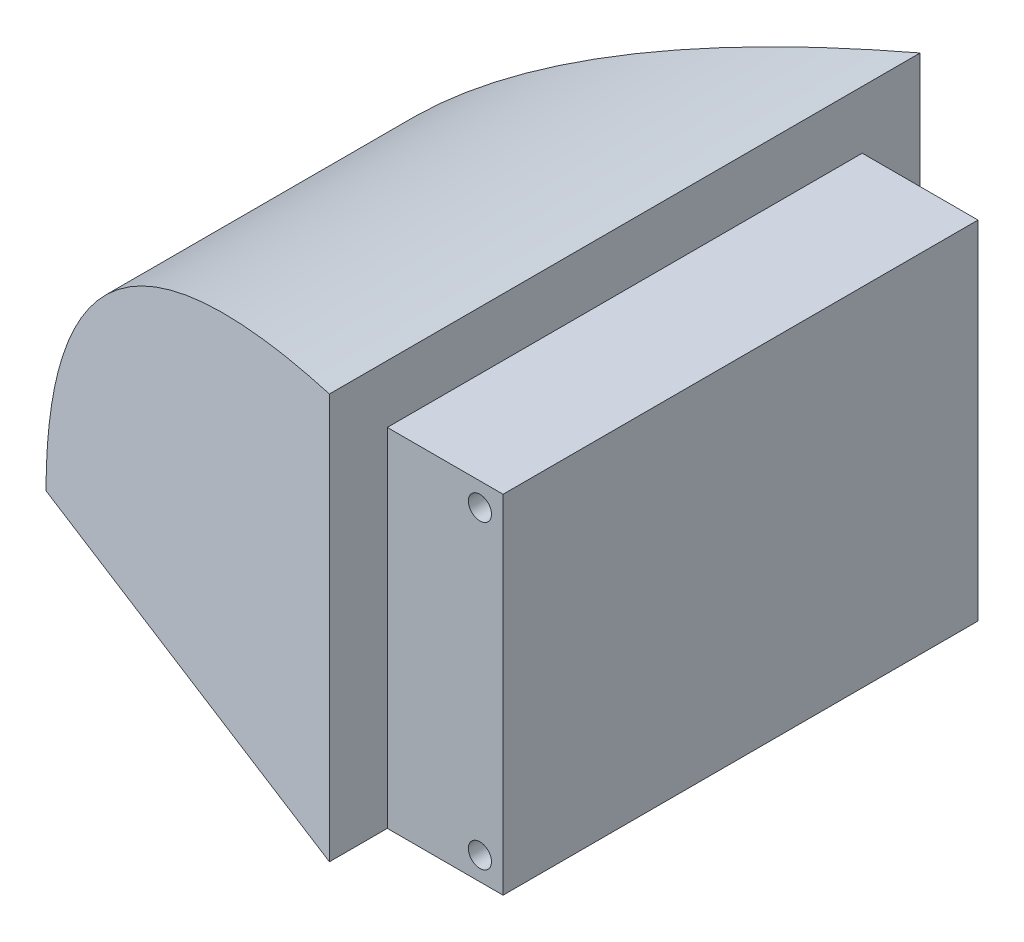
ISO-10303-21;
HEADER;
FILE_DESCRIPTION(('STEP AP214'),'2;1');
FILE_NAME('part.step','',(''),(''),'','','');
FILE_SCHEMA(('AUTOMOTIVE_DESIGN { 1 0 10303 214 1 1 1 1 }'));
ENDSEC;
DATA;
#1=APPLICATION_CONTEXT('core data for automotive mechanical design processes');
#2=APPLICATION_PROTOCOL_DEFINITION('international standard','automotive_design',2000,#1);
#3=PRODUCT_CONTEXT('',#1,'mechanical');
#4=PRODUCT('Part','Part','',(#3));
#5=PRODUCT_RELATED_PRODUCT_CATEGORY('part','',(#4));
#6=PRODUCT_DEFINITION_FORMATION('','',#4);
#7=PRODUCT_DEFINITION_CONTEXT('part definition',#1,'design');
#8=PRODUCT_DEFINITION('design','',#6,#7);
#9=PRODUCT_DEFINITION_SHAPE('','',#8);
#10=(LENGTH_UNIT() NAMED_UNIT(*) SI_UNIT(.MILLI.,.METRE.));
#11=(NAMED_UNIT(*) PLANE_ANGLE_UNIT() SI_UNIT($,.RADIAN.));
#12=(NAMED_UNIT(*) SI_UNIT($,.STERADIAN.) SOLID_ANGLE_UNIT());
#13=UNCERTAINTY_MEASURE_WITH_UNIT(LENGTH_MEASURE(1.E-05),#10,'distance_accuracy_value','');
#14=(GEOMETRIC_REPRESENTATION_CONTEXT(3) GLOBAL_UNCERTAINTY_ASSIGNED_CONTEXT((#13)) GLOBAL_UNIT_ASSIGNED_CONTEXT((#10,
#11,#12)) REPRESENTATION_CONTEXT('',''));
#15=CARTESIAN_POINT('',(0.,0.,0.));
#16=DIRECTION('',(0.,0.,1.));
#17=DIRECTION('',(1.,0.,0.));
#18=AXIS2_PLACEMENT_3D('',#15,#16,#17);
#19=CARTESIAN_POINT('',(-25.,-17.5,51.03));
#20=DIRECTION('',(0.,1.,0.));
#21=DIRECTION('',(0.,0.,1.));
#22=AXIS2_PLACEMENT_3D('',#19,#20,#21);
#23=PLANE('',#22);
#24=DIRECTION('',(-0.932323624442217,0.,-0.361625025830525));
#25=VECTOR('',#24,1.);
#26=CARTESIAN_POINT('',(-15.2432539503768,-17.5,39.2993978739976));
#27=LINE('',#26,#25);
#28=CARTESIAN_POINT('',(15.,-17.5,51.03));
#29=VERTEX_POINT('',#28);
#30=CARTESIAN_POINT('',(-24.9999999704446,-17.4999840573719,35.515));
#31=VERTEX_POINT('',#30);
#32=EDGE_CURVE('E135',#29,#31,#27,.T.);
#33=ORIENTED_EDGE('',*,*,#32,.T.);
#34=DIRECTION('',(0.,0.,-1.));
#35=VECTOR('',#34,1.);
#36=CARTESIAN_POINT('',(-25.,-17.5,51.03));
#37=LINE('',#36,#35);
#38=CARTESIAN_POINT('',(-24.9999999704446,-17.4999840573709,15.515));
#39=VERTEX_POINT('',#38);
#40=EDGE_CURVE('E154',#31,#39,#37,.T.);
#41=ORIENTED_EDGE('',*,*,#40,.T.);
#42=DIRECTION('',(-0.932323624442217,0.,0.361625025830525));
#43=VECTOR('',#42,1.);
#44=CARTESIAN_POINT('',(1.96158988960392,-17.5,5.05727332156988));
#45=LINE('',#44,#43);
#46=CARTESIAN_POINT('',(15.,-17.5,0.));
#47=VERTEX_POINT('',#46);
#48=EDGE_CURVE('E65',#47,#39,#45,.T.);
#49=ORIENTED_EDGE('',*,*,#48,.F.);
#50=DIRECTION('',(0.,0.,-1.));
#51=VECTOR('',#50,1.);
#52=CARTESIAN_POINT('',(15.,-17.5,51.03));
#53=LINE('',#52,#51);
#54=CARTESIAN_POINT('',(15.,-17.5,5.));
#55=VERTEX_POINT('',#54);
#56=EDGE_CURVE('E173',#55,#47,#53,.T.);
#57=ORIENTED_EDGE('',*,*,#56,.F.);
#58=DIRECTION('',(1.,0.,0.));
#59=VECTOR('',#58,1.);
#60=CARTESIAN_POINT('',(-25.,-17.5,4.99999999999998));
#61=LINE('',#60,#59);
#62=CARTESIAN_POINT('',(25.,-17.5,5.));
#63=VERTEX_POINT('',#62);
#64=EDGE_CURVE('E175',#55,#63,#61,.T.);
#65=ORIENTED_EDGE('',*,*,#64,.T.);
#66=DIRECTION('',(0.,0.,-1.));
#67=VECTOR('',#66,1.);
#68=CARTESIAN_POINT('',(25.,-17.5,51.03));
#69=LINE('',#68,#67);
#70=CARTESIAN_POINT('',(25.,-17.5,46.03));
#71=VERTEX_POINT('',#70);
#72=EDGE_CURVE('E159',#71,#63,#69,.T.);
#73=ORIENTED_EDGE('',*,*,#72,.F.);
#74=DIRECTION('',(1.,0.,0.));
#75=VECTOR('',#74,1.);
#76=CARTESIAN_POINT('',(-25.,-17.5,46.03));
#77=LINE('',#76,#75);
#78=CARTESIAN_POINT('',(15.,-17.5,46.03));
#79=VERTEX_POINT('',#78);
#80=EDGE_CURVE('E172',#79,#71,#77,.T.);
#81=ORIENTED_EDGE('',*,*,#80,.F.);
#82=DIRECTION('',(0.,0.,1.));
#83=VECTOR('',#82,1.);
#84=CARTESIAN_POINT('',(15.,-17.5,51.03));
#85=LINE('',#84,#83);
#86=EDGE_CURVE('E134',#79,#29,#85,.T.);
#87=ORIENTED_EDGE('',*,*,#86,.T.);
#88=EDGE_LOOP('',(#33,#41,#49,#57,#65,#73,#81,#87));
#89=FACE_BOUND('',#88,.T.);
#90=ADVANCED_FACE('F44',(#89),#23,.F.);
#91=CARTESIAN_POINT('',(15.,17.5,0.));
#92=CARTESIAN_POINT('',(-25.0988691364399,8.98885403745211,0.));
#93=CARTESIAN_POINT('',(-25.,-17.7627483341837,0.));
#94=B_SPLINE_CURVE_WITH_KNOTS('',2,(#91,#92,#93),.UNSPECIFIED.,.F.,.F.,(3,3),(0.,1.),.UNSPECIFIED.);
#95=DIRECTION('',(0.,0.,1.));
#96=VECTOR('',#95,1.);
#97=SURFACE_OF_LINEAR_EXTRUSION('',#94,#96);
#98=ORIENTED_EDGE('',*,*,#40,.F.);
#99=CARTESIAN_POINT('',(-24.9999999408892,-17.4999681147439,35.515));
#100=CARTESIAN_POINT('',(-24.998567938841,-17.112172585703,35.5155554524844));
#101=CARTESIAN_POINT('',(-24.9907346332893,-16.7243806117285,35.5185938019046));
#102=CARTESIAN_POINT('',(-24.9617265623105,-15.9489840650427,35.5298453118544));
#103=CARTESIAN_POINT('',(-24.9405383868522,-15.5613800730588,35.5380636737921));
#104=CARTESIAN_POINT('',(-24.8842693680968,-14.7871417084284,35.5598890182567));
#105=CARTESIAN_POINT('',(-24.8491820535896,-14.4005078719705,35.5734985108051));
#106=CARTESIAN_POINT('',(-24.7646464699439,-13.6290042013446,35.6062877506293));
#107=CARTESIAN_POINT('',(-24.7151967366608,-13.244134551088,35.6254680658102));
#108=CARTESIAN_POINT('',(-24.601624905182,-12.4774754090352,35.6695197398601));
#109=CARTESIAN_POINT('',(-24.5375248056618,-12.0956821787223,35.6943825659926));
#110=CARTESIAN_POINT('',(-24.3943205791411,-11.3354411502374,35.749927905377));
#111=CARTESIAN_POINT('',(-24.3152202225053,-10.9569925363491,35.7806089561988));
#112=CARTESIAN_POINT('',(-24.1418126119135,-10.2041977305489,35.847869433151));
#113=CARTESIAN_POINT('',(-24.0475084262727,-9.82985072712813,35.8844476691586));
#114=CARTESIAN_POINT('',(-23.8435971284151,-9.08600511142265,35.9635397638168));
#115=CARTESIAN_POINT('',(-23.7339906022122,-8.71650631406505,36.0060533951672));
#116=CARTESIAN_POINT('',(-23.4595129918599,-7.85810951408493,36.112516398282));
#117=CARTESIAN_POINT('',(-23.2885385029013,-7.3714392863445,36.1788331281871));
#118=CARTESIAN_POINT('',(-22.9194910221877,-6.40998786818405,36.321977419769));
#119=CARTESIAN_POINT('',(-22.7214134410647,-5.93520870742128,36.3988067615471));
#120=CARTESIAN_POINT('',(-22.2990088142225,-4.99930738472935,36.5626469561834));
#121=CARTESIAN_POINT('',(-22.0746829563474,-4.53818460597445,36.6496573483067));
#122=CARTESIAN_POINT('',(-21.6012590174584,-3.63160877482702,36.8332866586033));
#123=CARTESIAN_POINT('',(-21.3521933935708,-3.18613620294092,36.9298929874687));
#124=CARTESIAN_POINT('',(-20.8304984963321,-2.3113628195637,37.1322453957352));
#125=CARTESIAN_POINT('',(-20.5578686217257,-1.88206242111633,37.2379917083481));
#126=CARTESIAN_POINT('',(-19.9906942028894,-1.040441134762,37.4579844860543));
#127=CARTESIAN_POINT('',(-19.6961484839164,-0.628121158890323,37.5722314068009));
#128=CARTESIAN_POINT('',(-19.1111060156734,0.146988220534743,37.7991547541707));
#129=CARTESIAN_POINT('',(-18.8221423661173,0.51111180828939,37.9112365297423));
#130=CARTESIAN_POINT('',(-18.2285630561573,1.22438342794786,38.141471104593));
#131=CARTESIAN_POINT('',(-17.9239458335554,1.5735299587644,38.2596245098097));
#132=CARTESIAN_POINT('',(-16.9886376108621,2.59856984144768,38.6224071866869));
#133=CARTESIAN_POINT('',(-16.3364652785199,3.25209599528699,38.8753685300941));
#134=CARTESIAN_POINT('',(-14.9838575276732,4.50276359893512,39.4000112614537));
#135=CARTESIAN_POINT('',(-14.2832862455038,5.09973416111169,39.6717453475252));
#136=CARTESIAN_POINT('',(-12.8444769829324,6.23902434183808,40.2298234902451));
#137=CARTESIAN_POINT('',(-12.1062315921636,6.78133314571293,40.5161704211895));
#138=CARTESIAN_POINT('',(-10.702453211767,7.74499583163856,41.0606609604859));
#139=CARTESIAN_POINT('',(-10.040714954747,8.17276300106796,41.3173326869275));
#140=CARTESIAN_POINT('',(-8.6985510168258,8.99374321016668,41.8379245243487));
#141=CARTESIAN_POINT('',(-8.01811771463152,9.38694187472886,42.1018475914373));
#142=CARTESIAN_POINT('',(-6.64173772269818,10.1416204234042,42.6357109808084));
#143=CARTESIAN_POINT('',(-5.9457829850476,10.5030833492887,42.9056544246747));
#144=CARTESIAN_POINT('',(-4.54132973827641,11.1967632674944,43.450406727766));
#145=CARTESIAN_POINT('',(-3.8328307635277,11.5289791714536,43.7252157675967));
#146=CARTESIAN_POINT('',(-2.40375108912923,12.1673995573597,44.279520046304));
#147=CARTESIAN_POINT('',(-1.68314540710071,12.4735394844956,44.5590249752208));
#148=CARTESIAN_POINT('',(-0.233591153665069,13.0610629821727,45.1212708312722));
#149=CARTESIAN_POINT('',(0.495353745715018,13.342457008309,45.4040103341192));
#150=CARTESIAN_POINT('',(1.96034635402283,13.8826467812744,45.9722443420666));
#151=CARTESIAN_POINT('',(2.69639303051498,14.1414457595317,46.257738446711));
#152=CARTESIAN_POINT('',(4.17444913260726,14.6383103618176,46.83103945731));
#153=CARTESIAN_POINT('',(4.91645793824825,14.8763781118282,47.118846122798));
#154=CARTESIAN_POINT('',(6.17587208219542,15.2629563543775,47.6073413838815));
#155=CARTESIAN_POINT('',(6.69195865173841,15.416440204082,47.807518462043));
#156=CARTESIAN_POINT('',(7.7262532805094,15.7147780851063,48.2086954911776));
#157=CARTESIAN_POINT('',(8.24446117316913,15.859632780613,48.409695377543));
#158=CARTESIAN_POINT('',(9.28278930018341,16.1411838769457,48.8124368998086));
#159=CARTESIAN_POINT('',(9.80290950884242,16.2778803869698,49.0141785257423));
#160=CARTESIAN_POINT('',(10.8411855160164,16.5426067795997,49.4168998320249));
#161=CARTESIAN_POINT('',(11.3593292827887,16.6706910048478,49.6178748455617));
#162=CARTESIAN_POINT('',(12.3971267315815,16.9196291818275,50.0204105310122));
#163=CARTESIAN_POINT('',(12.916780426472,17.0404830717397,50.2219712079178));
#164=CARTESIAN_POINT('',(13.9574238515272,17.2753113688313,50.6256107764111));
#165=CARTESIAN_POINT('',(14.4784135466668,17.3892859544768,50.8276896544134));
#166=CARTESIAN_POINT('',(15.,17.5,51.03));
#167=B_SPLINE_CURVE_WITH_KNOTS('',3,(#99,#100,#101,#102,#103,#104,#105,#106,#107,#108,#109,#110,
#111,#112,#113,#114,#115,#116,#117,#118,#119,#120,#121,#122,#123,#124,#125,#126,#127,#128,#129,
#130,#131,#132,#133,#134,#135,#136,#137,#138,#139,#140,#141,#142,#143,#144,#145,#146,#147,#148,
#149,#150,#151,#152,#153,#154,#155,#156,#157,#158,#159,#160,#161,#162,#163,#164,#165,#166),
.UNSPECIFIED.,.F.,.F.,(4,2,2,2,2,2,2,2,2,2,2,2,2,2,2,2,2,2,2,2,2,2,2,2,2,2,2,2,2,2,2,2,2,4),(0.,
1.16337012895003,2.32791029833484,3.49299329688164,4.65819510890861,5.82165864198532,
6.98483012131061,8.14776715183187,9.31065965907347,10.8698985843159,12.4294018630663,
13.9888345950627,15.546247806475,17.1037007679113,18.6612372728741,20.0951905098375,
21.5292871316865,24.3973548760403,27.2738293926653,30.1508718991792,32.6359853761638,
35.1221274324096,37.609589992885,40.0971450795766,42.5906895651011,45.0831753691335,
47.5753041246617,50.0671770113215,51.7904108664501,53.5135119122418,55.2365898889596,
56.9475106849216,58.6584461071939,60.3693371245315),.UNSPECIFIED.);
#168=CARTESIAN_POINT('',(15.,17.5,51.03));
#169=VERTEX_POINT('',#168);
#170=EDGE_CURVE('E12',#31,#169,#167,.T.);
#171=ORIENTED_EDGE('',*,*,#170,.T.);
#172=DIRECTION('',(0.,0.,-1.));
#173=VECTOR('',#172,1.);
#174=CARTESIAN_POINT('',(15.,17.5,0.));
#175=LINE('',#174,#173);
#176=CARTESIAN_POINT('',(15.,17.5,0.));
#177=VERTEX_POINT('',#176);
#178=EDGE_CURVE('E73',#169,#177,#175,.T.);
#179=ORIENTED_EDGE('',*,*,#178,.T.);
#180=CARTESIAN_POINT('',(-24.9999999408892,-17.4999681147417,15.515));
#181=CARTESIAN_POINT('',(-24.9985679388409,-17.1121725857009,15.5144445475156));
#182=CARTESIAN_POINT('',(-24.9907346332892,-16.7243806117264,15.5114061980954));
#183=CARTESIAN_POINT('',(-24.9617265623104,-15.9489840650406,15.5001546881456));
#184=CARTESIAN_POINT('',(-24.9405383868521,-15.5613800730567,15.4919363262078));
#185=CARTESIAN_POINT('',(-24.8842693680966,-14.7871417084263,15.4701109817432));
#186=CARTESIAN_POINT('',(-24.8491820535894,-14.4005078719684,15.4565014891948));
#187=CARTESIAN_POINT('',(-24.7646464699436,-13.6290042013425,15.4237122493705));
#188=CARTESIAN_POINT('',(-24.7151967366605,-13.2441345510859,15.4045319341897));
#189=CARTESIAN_POINT('',(-24.6016249051816,-12.4774754090332,15.3604802601398));
#190=CARTESIAN_POINT('',(-24.5375248056614,-12.0956821787203,15.3356174340073));
#191=CARTESIAN_POINT('',(-24.3943205791407,-11.3354411502353,15.2800720946228));
#192=CARTESIAN_POINT('',(-24.3152202225048,-10.956992536347,15.249391043801));
#193=CARTESIAN_POINT('',(-24.141812611913,-10.2041977305469,15.1821305668488));
#194=CARTESIAN_POINT('',(-24.0475084262722,-9.82985072712613,15.1455523308412));
#195=CARTESIAN_POINT('',(-23.8435971284146,-9.08600511142068,15.066460236183));
#196=CARTESIAN_POINT('',(-23.7339906022116,-8.71650631406309,15.0239466048326));
#197=CARTESIAN_POINT('',(-23.4595129918592,-7.85810951408301,14.9174836017177));
#198=CARTESIAN_POINT('',(-23.2885385029006,-7.3714392863426,14.8511668718127));
#199=CARTESIAN_POINT('',(-22.919491022187,-6.40998786818219,14.7080225802307));
#200=CARTESIAN_POINT('',(-22.7214134410639,-5.93520870741944,14.6311932384526));
#201=CARTESIAN_POINT('',(-22.2990088142217,-4.99930738472756,14.4673530438163));
#202=CARTESIAN_POINT('',(-22.0746829563466,-4.53818460597269,14.3803426516929));
#203=CARTESIAN_POINT('',(-21.6012590174574,-3.63160877482531,14.1967133413963));
#204=CARTESIAN_POINT('',(-21.3521933935698,-3.18613620293924,14.1001070125309));
#205=CARTESIAN_POINT('',(-20.8304984963311,-2.31136281956207,13.8977546042644));
#206=CARTESIAN_POINT('',(-20.5578686217247,-1.88206242111473,13.7920082916515));
#207=CARTESIAN_POINT('',(-19.9906942028883,-1.04044113476046,13.5720155139453));
#208=CARTESIAN_POINT('',(-19.6961484839153,-0.628121158888808,13.4577685931987));
#209=CARTESIAN_POINT('',(-19.1111060156722,0.146988220536241,13.2308452458289));
#210=CARTESIAN_POINT('',(-18.8221423661161,0.511111808290893,13.1187634702573));
#211=CARTESIAN_POINT('',(-18.228563056156,1.22438342794937,12.8885288954065));
#212=CARTESIAN_POINT('',(-17.9239458335541,1.57352995876592,12.7703754901898));
#213=CARTESIAN_POINT('',(-16.9886376108606,2.59856984144921,12.4075928133126));
#214=CARTESIAN_POINT('',(-16.3364652785183,3.25209599528853,12.1546314699053));
#215=CARTESIAN_POINT('',(-14.9838575276715,4.50276359893666,11.6299887385456));
#216=CARTESIAN_POINT('',(-14.283286245502,5.09973416111322,11.3582546524741));
#217=CARTESIAN_POINT('',(-12.8444769829303,6.23902434183959,10.8001765097541));
#218=CARTESIAN_POINT('',(-12.1062315921615,6.78133314571445,10.5138295788097));
#219=CARTESIAN_POINT('',(-10.7024532117647,7.74499583164008,9.96933903951322));
#220=CARTESIAN_POINT('',(-10.0407149547446,8.1727630010695,9.71266731307155));
#221=CARTESIAN_POINT('',(-8.69855101682314,8.99374321016826,9.19207547565028));
#222=CARTESIAN_POINT('',(-8.01811771462875,9.38694187473044,8.92815240856163));
#223=CARTESIAN_POINT('',(-6.64173772269516,10.1416204234058,8.39428901919039));
#224=CARTESIAN_POINT('',(-5.94578298504446,10.5030833492903,8.12434557532412));
#225=CARTESIAN_POINT('',(-4.54132973827303,11.196763267496,7.57959327223265));
#226=CARTESIAN_POINT('',(-3.83283076352421,11.5289791714552,7.30478423240195));
#227=CARTESIAN_POINT('',(-2.4037510891255,12.1673995573613,6.75047995369455));
#228=CARTESIAN_POINT('',(-1.68314540709686,12.4735394844972,6.4709750247777));
#229=CARTESIAN_POINT('',(-0.233591153660987,13.0610629821743,5.90872916872626));
#230=CARTESIAN_POINT('',(0.495353745719216,13.3424570083106,5.62598966587916));
#231=CARTESIAN_POINT('',(1.96034635402726,13.882646781276,5.05775565793168));
#232=CARTESIAN_POINT('',(2.69639303051953,14.1414457595333,4.77226155328724));
#233=CARTESIAN_POINT('',(4.17444913261204,14.6383103618192,4.19896054268811));
#234=CARTESIAN_POINT('',(4.91645793825314,14.8763781118298,3.91115387720007));
#235=CARTESIAN_POINT('',(6.17587208220016,15.262956354379,3.42265861611662));
#236=CARTESIAN_POINT('',(6.69195865174287,15.4164402040833,3.22248153795524));
#237=CARTESIAN_POINT('',(7.7262532805133,15.7147780851074,2.8213045088209));
#238=CARTESIAN_POINT('',(8.24446117317276,15.859632780614,2.62030462245562));
#239=CARTESIAN_POINT('',(9.28278930018648,16.1411838769465,2.21756310019017));
#240=CARTESIAN_POINT('',(9.80290950884522,16.2778803869706,2.01582147425666));
#241=CARTESIAN_POINT('',(10.8411855160187,16.5426067796002,1.61310016797426));
#242=CARTESIAN_POINT('',(11.3593292827907,16.6706910048483,1.41212515443757));
#243=CARTESIAN_POINT('',(12.3971267315829,16.9196291818279,1.0095894689873));
#244=CARTESIAN_POINT('',(12.9167804264731,17.0404830717399,0.808028792081731));
#245=CARTESIAN_POINT('',(13.9574238515277,17.2753113688314,0.404389223588679));
#246=CARTESIAN_POINT('',(14.4784135466671,17.3892859544768,0.202310345586502));
#247=CARTESIAN_POINT('',(15.,17.5,0.));
#248=B_SPLINE_CURVE_WITH_KNOTS('',3,(#180,#181,#182,#183,#184,#185,#186,#187,#188,#189,#190,
#191,#192,#193,#194,#195,#196,#197,#198,#199,#200,#201,#202,#203,#204,#205,#206,#207,#208,#209,
#210,#211,#212,#213,#214,#215,#216,#217,#218,#219,#220,#221,#222,#223,#224,#225,#226,#227,#228,
#229,#230,#231,#232,#233,#234,#235,#236,#237,#238,#239,#240,#241,#242,#243,#244,#245,#246,#247),
.UNSPECIFIED.,.F.,.F.,(4,2,2,2,2,2,2,2,2,2,2,2,2,2,2,2,2,2,2,2,2,2,2,2,2,2,2,2,2,2,2,2,2,4),(0.,
1.16337012895002,2.32791029833482,3.4929932968816,4.65819510890856,5.82165864198526,
6.98483012131053,8.14776715183177,9.31065965907335,10.8698985843158,12.4294018630661,
13.9888345950625,15.5462478064748,17.1037007679111,18.6612372728738,20.0951905098374,
21.5292871316864,24.3973548760404,27.2738293926657,30.1508718991798,32.6359853761648,
35.122127432411,37.6095899928867,40.0971450795786,42.5906895651035,45.0831753691362,
47.5753041246647,50.0671770113249,51.7904108664526,53.5135119122433,55.2365898889602,
56.9475106849212,58.6584461071927,60.3693371245293),.UNSPECIFIED.);
#249=EDGE_CURVE('E58',#39,#177,#248,.T.);
#250=ORIENTED_EDGE('',*,*,#249,.F.);
#251=EDGE_LOOP('',(#98,#171,#179,#250));
#252=FACE_BOUND('',#251,.T.);
#253=ADVANCED_FACE('F167',(#252),#97,.T.);
#254=CARTESIAN_POINT('',(25.,17.5,51.03));
#255=DIRECTION('',(-1.,0.,0.));
#256=DIRECTION('',(0.,0.,1.));
#257=AXIS2_PLACEMENT_3D('',#254,#255,#256);
#258=PLANE('',#257);
#259=DIRECTION('',(0.,1.,0.));
#260=VECTOR('',#259,1.);
#261=CARTESIAN_POINT('',(25.,-33.53,5.));
#262=LINE('',#261,#260);
#263=CARTESIAN_POINT('',(25.,12.5,5.));
#264=VERTEX_POINT('',#263);
#265=EDGE_CURVE('E148',#63,#264,#262,.T.);
#266=ORIENTED_EDGE('',*,*,#265,.T.);
#267=DIRECTION('',(0.,0.,-1.));
#268=VECTOR('',#267,1.);
#269=CARTESIAN_POINT('',(25.,12.5,46.03));
#270=LINE('',#269,#268);
#271=CARTESIAN_POINT('',(25.,12.5,46.03));
#272=VERTEX_POINT('',#271);
#273=EDGE_CURVE('E120',#272,#264,#270,.T.);
#274=ORIENTED_EDGE('',*,*,#273,.F.);
#275=DIRECTION('',(0.,1.,0.));
#276=VECTOR('',#275,1.);
#277=CARTESIAN_POINT('',(25.,-33.53,46.03));
#278=LINE('',#277,#276);
#279=EDGE_CURVE('E129',#71,#272,#278,.T.);
#280=ORIENTED_EDGE('',*,*,#279,.F.);
#281=ORIENTED_EDGE('',*,*,#72,.T.);
#282=EDGE_LOOP('',(#266,#274,#280,#281));
#283=FACE_BOUND('',#282,.T.);
#284=ADVANCED_FACE('F183',(#283),#258,.F.);
#285=CARTESIAN_POINT('',(0.,-33.53,4.99999999999999));
#286=DIRECTION('',(0.,0.,1.));
#287=DIRECTION('',(1.,0.,0.));
#288=AXIS2_PLACEMENT_3D('',#285,#286,#287);
#289=PLANE('',#288);
#290=CARTESIAN_POINT('',(23.,10.5,5.));
#291=DIRECTION('',(0.,0.,1.));
#292=DIRECTION('',(1.,0.,0.));
#293=AXIS2_PLACEMENT_3D('',#290,#291,#292);
#294=CIRCLE('',#293,1.);
#295=CARTESIAN_POINT('',(24.,10.5,5.));
#296=VERTEX_POINT('',#295);
#297=EDGE_CURVE('E184',#296,#296,#294,.T.);
#298=ORIENTED_EDGE('',*,*,#297,.T.);
#299=EDGE_LOOP('',(#298));
#300=FACE_BOUND('',#299,.T.);
#301=CARTESIAN_POINT('',(23.,-15.5,5.));
#302=DIRECTION('',(0.,0.,1.));
#303=DIRECTION('',(1.,0.,0.));
#304=AXIS2_PLACEMENT_3D('',#301,#302,#303);
#305=CIRCLE('',#304,1.);
#306=CARTESIAN_POINT('',(24.,-15.5,5.));
#307=VERTEX_POINT('',#306);
#308=EDGE_CURVE('E187',#307,#307,#305,.T.);
#309=ORIENTED_EDGE('',*,*,#308,.T.);
#310=EDGE_LOOP('',(#309));
#311=FACE_BOUND('',#310,.T.);
#312=DIRECTION('',(0.,1.,0.));
#313=VECTOR('',#312,1.);
#314=CARTESIAN_POINT('',(15.,-33.53,5.));
#315=LINE('',#314,#313);
#316=CARTESIAN_POINT('',(15.,12.5,5.));
#317=VERTEX_POINT('',#316);
#318=EDGE_CURVE('E146',#55,#317,#315,.T.);
#319=ORIENTED_EDGE('',*,*,#318,.T.);
#320=DIRECTION('',(1.,0.,0.));
#321=VECTOR('',#320,1.);
#322=CARTESIAN_POINT('',(15.,12.5,5.));
#323=LINE('',#322,#321);
#324=EDGE_CURVE('E116',#317,#264,#323,.T.);
#325=ORIENTED_EDGE('',*,*,#324,.T.);
#326=ORIENTED_EDGE('',*,*,#265,.F.);
#327=ORIENTED_EDGE('',*,*,#64,.F.);
#328=EDGE_LOOP('',(#319,#325,#326,#327));
#329=FACE_BOUND('',#328,.T.);
#330=ADVANCED_FACE('F208',(#300,#311,#329),#289,.F.);
#331=CARTESIAN_POINT('',(15.,-33.53,0.));
#332=DIRECTION('',(1.,0.,0.));
#333=DIRECTION('',(0.,0.,-1.));
#334=AXIS2_PLACEMENT_3D('',#331,#332,#333);
#335=PLANE('',#334);
#336=ORIENTED_EDGE('',*,*,#56,.T.);
#337=DIRECTION('',(0.,1.,0.));
#338=VECTOR('',#337,1.);
#339=CARTESIAN_POINT('',(15.,0.,0.));
#340=LINE('',#339,#338);
#341=EDGE_CURVE('E158',#47,#177,#340,.T.);
#342=ORIENTED_EDGE('',*,*,#341,.T.);
#343=ORIENTED_EDGE('',*,*,#178,.F.);
#344=DIRECTION('',(0.,-1.,0.));
#345=VECTOR('',#344,1.);
#346=CARTESIAN_POINT('',(15.,0.,51.03));
#347=LINE('',#346,#345);
#348=EDGE_CURVE('E142',#169,#29,#347,.T.);
#349=ORIENTED_EDGE('',*,*,#348,.T.);
#350=ORIENTED_EDGE('',*,*,#86,.F.);
#351=DIRECTION('',(0.,1.,0.));
#352=VECTOR('',#351,1.);
#353=CARTESIAN_POINT('',(15.,-33.53,46.03));
#354=LINE('',#353,#352);
#355=CARTESIAN_POINT('',(15.,12.5,46.03));
#356=VERTEX_POINT('',#355);
#357=EDGE_CURVE('E126',#79,#356,#354,.T.);
#358=ORIENTED_EDGE('',*,*,#357,.T.);
#359=DIRECTION('',(0.,0.,-1.));
#360=VECTOR('',#359,1.);
#361=CARTESIAN_POINT('',(15.,12.5,46.03));
#362=LINE('',#361,#360);
#363=EDGE_CURVE('E110',#356,#317,#362,.T.);
#364=ORIENTED_EDGE('',*,*,#363,.T.);
#365=ORIENTED_EDGE('',*,*,#318,.F.);
#366=EDGE_LOOP('',(#336,#342,#343,#349,#350,#358,#364,#365));
#367=FACE_BOUND('',#366,.T.);
#368=ADVANCED_FACE('F132',(#367),#335,.T.);
#369=CARTESIAN_POINT('',(0.,-33.53,46.03));
#370=DIRECTION('',(0.,0.,1.));
#371=DIRECTION('',(1.,0.,0.));
#372=AXIS2_PLACEMENT_3D('',#369,#370,#371);
#373=PLANE('',#372);
#374=CARTESIAN_POINT('',(23.,10.5,46.03));
#375=DIRECTION('',(0.,0.,1.));
#376=DIRECTION('',(1.,0.,0.));
#377=AXIS2_PLACEMENT_3D('',#374,#375,#376);
#378=CIRCLE('',#377,1.);
#379=CARTESIAN_POINT('',(24.,10.5,46.03));
#380=VERTEX_POINT('',#379);
#381=EDGE_CURVE('E354',#380,#380,#378,.T.);
#382=ORIENTED_EDGE('',*,*,#381,.F.);
#383=EDGE_LOOP('',(#382));
#384=FACE_BOUND('',#383,.T.);
#385=CARTESIAN_POINT('',(23.,-15.5,46.03));
#386=DIRECTION('',(0.,0.,1.));
#387=DIRECTION('',(1.,0.,0.));
#388=AXIS2_PLACEMENT_3D('',#385,#386,#387);
#389=CIRCLE('',#388,1.);
#390=CARTESIAN_POINT('',(24.,-15.5,46.03));
#391=VERTEX_POINT('',#390);
#392=EDGE_CURVE('E362',#391,#391,#389,.T.);
#393=ORIENTED_EDGE('',*,*,#392,.F.);
#394=EDGE_LOOP('',(#393));
#395=FACE_BOUND('',#394,.T.);
#396=DIRECTION('',(1.,0.,0.));
#397=VECTOR('',#396,1.);
#398=CARTESIAN_POINT('',(15.,12.5,46.03));
#399=LINE('',#398,#397);
#400=EDGE_CURVE('E113',#356,#272,#399,.T.);
#401=ORIENTED_EDGE('',*,*,#400,.F.);
#402=ORIENTED_EDGE('',*,*,#357,.F.);
#403=ORIENTED_EDGE('',*,*,#80,.T.);
#404=ORIENTED_EDGE('',*,*,#279,.T.);
#405=EDGE_LOOP('',(#401,#402,#403,#404));
#406=FACE_BOUND('',#405,.T.);
#407=ADVANCED_FACE('F125',(#384,#395,#406),#373,.T.);
#408=CARTESIAN_POINT('',(1.96158988960392,17.5005,5.05727332156988));
#409=DIRECTION('',(0.361625025830525,0.,0.932323624442217));
#410=DIRECTION('',(0.932323624442217,0.,-0.361625025830525));
#411=AXIS2_PLACEMENT_3D('',#408,#409,#410);
#412=PLANE('',#411);
#413=ORIENTED_EDGE('',*,*,#249,.T.);
#414=ORIENTED_EDGE('',*,*,#341,.F.);
#415=ORIENTED_EDGE('',*,*,#48,.T.);
#416=EDGE_LOOP('',(#413,#414,#415));
#417=FACE_BOUND('',#416,.T.);
#418=ADVANCED_FACE('F164',(#417),#412,.F.);
#419=CARTESIAN_POINT('',(-15.2432539503768,17.5005,39.2993978739976));
#420=DIRECTION('',(-0.361625025830525,0.,0.932323624442217));
#421=DIRECTION('',(0.932323624442217,0.,0.361625025830525));
#422=AXIS2_PLACEMENT_3D('',#419,#420,#421);
#423=PLANE('',#422);
#424=ORIENTED_EDGE('',*,*,#32,.F.);
#425=ORIENTED_EDGE('',*,*,#348,.F.);
#426=ORIENTED_EDGE('',*,*,#170,.F.);
#427=EDGE_LOOP('',(#424,#425,#426));
#428=FACE_BOUND('',#427,.T.);
#429=ADVANCED_FACE('F169',(#428),#423,.T.);
#430=CARTESIAN_POINT('',(15.,12.5,46.03));
#431=DIRECTION('',(0.,-1.,0.));
#432=DIRECTION('',(0.,0.,-1.));
#433=AXIS2_PLACEMENT_3D('',#430,#431,#432);
#434=PLANE('',#433);
#435=ORIENTED_EDGE('',*,*,#273,.T.);
#436=ORIENTED_EDGE('',*,*,#324,.F.);
#437=ORIENTED_EDGE('',*,*,#363,.F.);
#438=ORIENTED_EDGE('',*,*,#400,.T.);
#439=EDGE_LOOP('',(#435,#436,#437,#438));
#440=FACE_BOUND('',#439,.T.);
#441=ADVANCED_FACE('F112',(#440),#434,.F.);
#442=CARTESIAN_POINT('',(23.,-15.5,-3.2622911144252));
#443=DIRECTION('',(0.,0.,1.));
#444=DIRECTION('',(1.,0.,0.));
#445=AXIS2_PLACEMENT_3D('',#442,#443,#444);
#446=CYLINDRICAL_SURFACE('',#445,1.);
#447=CARTESIAN_POINT('',(24.,-15.5,46.03));
#448=CARTESIAN_POINT('',(24.,-15.5,45.6026041666667));
#449=CARTESIAN_POINT('',(24.,-15.5,45.1752083333334));
#450=CARTESIAN_POINT('',(24.,-15.5,44.3204166666667));
#451=CARTESIAN_POINT('',(24.,-15.5,43.8930208333333));
#452=CARTESIAN_POINT('',(24.,-15.5,43.0382291666667));
#453=CARTESIAN_POINT('',(24.,-15.5,42.6108333333333));
#454=CARTESIAN_POINT('',(24.,-15.5,41.7560416666667));
#455=CARTESIAN_POINT('',(24.,-15.5,41.3286458333333));
#456=CARTESIAN_POINT('',(24.,-15.5,40.4738541666667));
#457=CARTESIAN_POINT('',(24.,-15.5,40.0464583333333));
#458=CARTESIAN_POINT('',(24.,-15.5,39.1916666666667));
#459=CARTESIAN_POINT('',(24.,-15.5,38.7642708333333));
#460=CARTESIAN_POINT('',(24.,-15.5,37.9094791666667));
#461=CARTESIAN_POINT('',(24.,-15.5,37.4820833333333));
#462=CARTESIAN_POINT('',(24.,-15.5,36.6272916666667));
#463=CARTESIAN_POINT('',(24.,-15.5,36.1998958333333));
#464=CARTESIAN_POINT('',(24.,-15.5,35.3451041666667));
#465=CARTESIAN_POINT('',(24.,-15.5,34.9177083333333));
#466=CARTESIAN_POINT('',(24.,-15.5,34.0629166666667));
#467=CARTESIAN_POINT('',(24.,-15.5,33.6355208333333));
#468=CARTESIAN_POINT('',(24.,-15.5,32.7807291666667));
#469=CARTESIAN_POINT('',(24.,-15.5,32.3533333333333));
#470=CARTESIAN_POINT('',(24.,-15.5,31.4985416666667));
#471=CARTESIAN_POINT('',(24.,-15.5,31.0711458333333));
#472=CARTESIAN_POINT('',(24.,-15.5,30.2163541666667));
#473=CARTESIAN_POINT('',(24.,-15.5,29.7889583333333));
#474=CARTESIAN_POINT('',(24.,-15.5,28.9341666666667));
#475=CARTESIAN_POINT('',(24.,-15.5,28.5067708333333));
#476=CARTESIAN_POINT('',(24.,-15.5,27.6519791666667));
#477=CARTESIAN_POINT('',(24.,-15.5,27.2245833333333));
#478=CARTESIAN_POINT('',(24.,-15.5,26.3697916666667));
#479=CARTESIAN_POINT('',(24.,-15.5,25.9423958333333));
#480=CARTESIAN_POINT('',(24.,-15.5,25.0876041666667));
#481=CARTESIAN_POINT('',(24.,-15.5,24.6602083333333));
#482=CARTESIAN_POINT('',(24.,-15.5,23.8054166666667));
#483=CARTESIAN_POINT('',(24.,-15.5,23.3780208333333));
#484=CARTESIAN_POINT('',(24.,-15.5,22.5232291666667));
#485=CARTESIAN_POINT('',(24.,-15.5,22.0958333333333));
#486=CARTESIAN_POINT('',(24.,-15.5,21.2410416666667));
#487=CARTESIAN_POINT('',(24.,-15.5,20.8136458333333));
#488=CARTESIAN_POINT('',(24.,-15.5,19.9588541666667));
#489=CARTESIAN_POINT('',(24.,-15.5,19.5314583333333));
#490=CARTESIAN_POINT('',(24.,-15.5,18.6766666666667));
#491=CARTESIAN_POINT('',(24.,-15.5,18.2492708333333));
#492=CARTESIAN_POINT('',(24.,-15.5,17.3944791666667));
#493=CARTESIAN_POINT('',(24.,-15.5,16.9670833333333));
#494=CARTESIAN_POINT('',(24.,-15.5,16.1122916666667));
#495=CARTESIAN_POINT('',(24.,-15.5,15.6848958333333));
#496=CARTESIAN_POINT('',(24.,-15.5,14.8301041666667));
#497=CARTESIAN_POINT('',(24.,-15.5,14.4027083333333));
#498=CARTESIAN_POINT('',(24.,-15.5,13.5479166666667));
#499=CARTESIAN_POINT('',(24.,-15.5,13.1205208333333));
#500=CARTESIAN_POINT('',(24.,-15.5,12.2657291666667));
#501=CARTESIAN_POINT('',(24.,-15.5,11.8383333333333));
#502=CARTESIAN_POINT('',(24.,-15.5,10.9835416666667));
#503=CARTESIAN_POINT('',(24.,-15.5,10.5561458333333));
#504=CARTESIAN_POINT('',(24.,-15.5,9.70135416666666));
#505=CARTESIAN_POINT('',(24.,-15.5,9.27395833333333));
#506=CARTESIAN_POINT('',(24.,-15.5,8.41916666666667));
#507=CARTESIAN_POINT('',(24.,-15.5,7.99177083333333));
#508=CARTESIAN_POINT('',(24.,-15.5,7.13697916666666));
#509=CARTESIAN_POINT('',(24.,-15.5,6.70958333333333));
#510=CARTESIAN_POINT('',(24.,-15.5,5.85479166666667));
#511=CARTESIAN_POINT('',(24.,-15.5,5.42739583333333));
#512=CARTESIAN_POINT('',(24.,-15.5,5.));
#513=B_SPLINE_CURVE_WITH_KNOTS('',3,(#447,#448,#449,#450,#451,#452,#453,#454,#455,#456,#457,
#458,#459,#460,#461,#462,#463,#464,#465,#466,#467,#468,#469,#470,#471,#472,#473,#474,#475,#476,
#477,#478,#479,#480,#481,#482,#483,#484,#485,#486,#487,#488,#489,#490,#491,#492,#493,#494,#495,
#496,#497,#498,#499,#500,#501,#502,#503,#504,#505,#506,#507,#508,#509,#510,#511,#512),
.UNSPECIFIED.,.F.,.F.,(4,2,2,2,2,2,2,2,2,2,2,2,2,2,2,2,2,2,2,2,2,2,2,2,2,2,2,2,2,2,2,2,4),(0.,
1.2821875,2.564375,3.8465625,5.12875,6.41093750000001,7.693125,8.97531250000001,10.2575,
11.5396875,12.821875,14.1040625,15.38625,16.6684375,17.950625,19.2328125,20.515,21.7971875,
23.079375,24.3615625,25.64375,26.9259375,28.208125,29.4903125,30.7725,32.0546875,33.336875,
34.6190625,35.90125,37.1834375,38.465625,39.7478125,41.03),.UNSPECIFIED.);
#514=EDGE_CURVE('BSEAM259',#391,#307,#513,.T.);
#515=ORIENTED_EDGE('',*,*,#392,.T.);
#516=ORIENTED_EDGE('',*,*,#308,.F.);
#517=ORIENTED_EDGE('',*,*,#514,.T.);
#518=ORIENTED_EDGE('',*,*,#514,.F.);
#519=EDGE_LOOP('',(#515,#517,#516,#518));
#520=FACE_BOUND('',#519,.T.);
#521=ADVANCED_FACE('F259',(#520),#446,.F.);
#522=CARTESIAN_POINT('',(23.,10.5,-3.2622911144252));
#523=DIRECTION('',(0.,0.,1.));
#524=DIRECTION('',(1.,0.,0.));
#525=AXIS2_PLACEMENT_3D('',#522,#523,#524);
#526=CYLINDRICAL_SURFACE('',#525,1.);
#527=CARTESIAN_POINT('',(24.,10.5,46.03));
#528=CARTESIAN_POINT('',(24.,10.5,45.6026041666667));
#529=CARTESIAN_POINT('',(24.,10.5,45.1752083333334));
#530=CARTESIAN_POINT('',(24.,10.5,44.3204166666667));
#531=CARTESIAN_POINT('',(24.,10.5,43.8930208333333));
#532=CARTESIAN_POINT('',(24.,10.5,43.0382291666667));
#533=CARTESIAN_POINT('',(24.,10.5,42.6108333333333));
#534=CARTESIAN_POINT('',(24.,10.5,41.7560416666667));
#535=CARTESIAN_POINT('',(24.,10.5,41.3286458333333));
#536=CARTESIAN_POINT('',(24.,10.5,40.4738541666667));
#537=CARTESIAN_POINT('',(24.,10.5,40.0464583333333));
#538=CARTESIAN_POINT('',(24.,10.5,39.1916666666667));
#539=CARTESIAN_POINT('',(24.,10.5,38.7642708333333));
#540=CARTESIAN_POINT('',(24.,10.5,37.9094791666667));
#541=CARTESIAN_POINT('',(24.,10.5,37.4820833333333));
#542=CARTESIAN_POINT('',(24.,10.5,36.6272916666667));
#543=CARTESIAN_POINT('',(24.,10.5,36.1998958333333));
#544=CARTESIAN_POINT('',(24.,10.5,35.3451041666667));
#545=CARTESIAN_POINT('',(24.,10.5,34.9177083333333));
#546=CARTESIAN_POINT('',(24.,10.5,34.0629166666667));
#547=CARTESIAN_POINT('',(24.,10.5,33.6355208333333));
#548=CARTESIAN_POINT('',(24.,10.5,32.7807291666667));
#549=CARTESIAN_POINT('',(24.,10.5,32.3533333333333));
#550=CARTESIAN_POINT('',(24.,10.5,31.4985416666667));
#551=CARTESIAN_POINT('',(24.,10.5,31.0711458333333));
#552=CARTESIAN_POINT('',(24.,10.5,30.2163541666667));
#553=CARTESIAN_POINT('',(24.,10.5,29.7889583333333));
#554=CARTESIAN_POINT('',(24.,10.5,28.9341666666667));
#555=CARTESIAN_POINT('',(24.,10.5,28.5067708333333));
#556=CARTESIAN_POINT('',(24.,10.5,27.6519791666667));
#557=CARTESIAN_POINT('',(24.,10.5,27.2245833333333));
#558=CARTESIAN_POINT('',(24.,10.5,26.3697916666667));
#559=CARTESIAN_POINT('',(24.,10.5,25.9423958333333));
#560=CARTESIAN_POINT('',(24.,10.5,25.0876041666667));
#561=CARTESIAN_POINT('',(24.,10.5,24.6602083333333));
#562=CARTESIAN_POINT('',(24.,10.5,23.8054166666667));
#563=CARTESIAN_POINT('',(24.,10.5,23.3780208333333));
#564=CARTESIAN_POINT('',(24.,10.5,22.5232291666667));
#565=CARTESIAN_POINT('',(24.,10.5,22.0958333333333));
#566=CARTESIAN_POINT('',(24.,10.5,21.2410416666667));
#567=CARTESIAN_POINT('',(24.,10.5,20.8136458333333));
#568=CARTESIAN_POINT('',(24.,10.5,19.9588541666667));
#569=CARTESIAN_POINT('',(24.,10.5,19.5314583333333));
#570=CARTESIAN_POINT('',(24.,10.5,18.6766666666667));
#571=CARTESIAN_POINT('',(24.,10.5,18.2492708333333));
#572=CARTESIAN_POINT('',(24.,10.5,17.3944791666667));
#573=CARTESIAN_POINT('',(24.,10.5,16.9670833333333));
#574=CARTESIAN_POINT('',(24.,10.5,16.1122916666667));
#575=CARTESIAN_POINT('',(24.,10.5,15.6848958333333));
#576=CARTESIAN_POINT('',(24.,10.5,14.8301041666667));
#577=CARTESIAN_POINT('',(24.,10.5,14.4027083333333));
#578=CARTESIAN_POINT('',(24.,10.5,13.5479166666667));
#579=CARTESIAN_POINT('',(24.,10.5,13.1205208333333));
#580=CARTESIAN_POINT('',(24.,10.5,12.2657291666667));
#581=CARTESIAN_POINT('',(24.,10.5,11.8383333333333));
#582=CARTESIAN_POINT('',(24.,10.5,10.9835416666667));
#583=CARTESIAN_POINT('',(24.,10.5,10.5561458333333));
#584=CARTESIAN_POINT('',(24.,10.5,9.70135416666666));
#585=CARTESIAN_POINT('',(24.,10.5,9.27395833333333));
#586=CARTESIAN_POINT('',(24.,10.5,8.41916666666667));
#587=CARTESIAN_POINT('',(24.,10.5,7.99177083333333));
#588=CARTESIAN_POINT('',(24.,10.5,7.13697916666666));
#589=CARTESIAN_POINT('',(24.,10.5,6.70958333333333));
#590=CARTESIAN_POINT('',(24.,10.5,5.85479166666667));
#591=CARTESIAN_POINT('',(24.,10.5,5.42739583333333));
#592=CARTESIAN_POINT('',(24.,10.5,5.));
#593=B_SPLINE_CURVE_WITH_KNOTS('',3,(#527,#528,#529,#530,#531,#532,#533,#534,#535,#536,#537,
#538,#539,#540,#541,#542,#543,#544,#545,#546,#547,#548,#549,#550,#551,#552,#553,#554,#555,#556,
#557,#558,#559,#560,#561,#562,#563,#564,#565,#566,#567,#568,#569,#570,#571,#572,#573,#574,#575,
#576,#577,#578,#579,#580,#581,#582,#583,#584,#585,#586,#587,#588,#589,#590,#591,#592),
.UNSPECIFIED.,.F.,.F.,(4,2,2,2,2,2,2,2,2,2,2,2,2,2,2,2,2,2,2,2,2,2,2,2,2,2,2,2,2,2,2,2,4),(0.,
1.2821875,2.564375,3.8465625,5.12875,6.41093750000001,7.693125,8.97531250000001,10.2575,
11.5396875,12.821875,14.1040625,15.38625,16.6684375,17.950625,19.2328125,20.515,21.7971875,
23.079375,24.3615625,25.64375,26.9259375,28.208125,29.4903125,30.7725,32.0546875,33.336875,
34.6190625,35.90125,37.1834375,38.465625,39.7478125,41.03),.UNSPECIFIED.);
#594=EDGE_CURVE('BSEAM333',#380,#296,#593,.T.);
#595=ORIENTED_EDGE('',*,*,#381,.T.);
#596=ORIENTED_EDGE('',*,*,#297,.F.);
#597=ORIENTED_EDGE('',*,*,#594,.T.);
#598=ORIENTED_EDGE('',*,*,#594,.F.);
#599=EDGE_LOOP('',(#595,#597,#596,#598));
#600=FACE_BOUND('',#599,.T.);
#601=ADVANCED_FACE('F333',(#600),#526,.F.);
#602=CLOSED_SHELL('',(#90,#253,#284,#330,#368,#407,#418,#429,#441,#521,#601));
#603=MANIFOLD_SOLID_BREP('B2',#602);
#604=ADVANCED_BREP_SHAPE_REPRESENTATION('',(#18,#603),#14);
#605=SHAPE_DEFINITION_REPRESENTATION(#9,#604);
ENDSEC;
END-ISO-10303-21;
